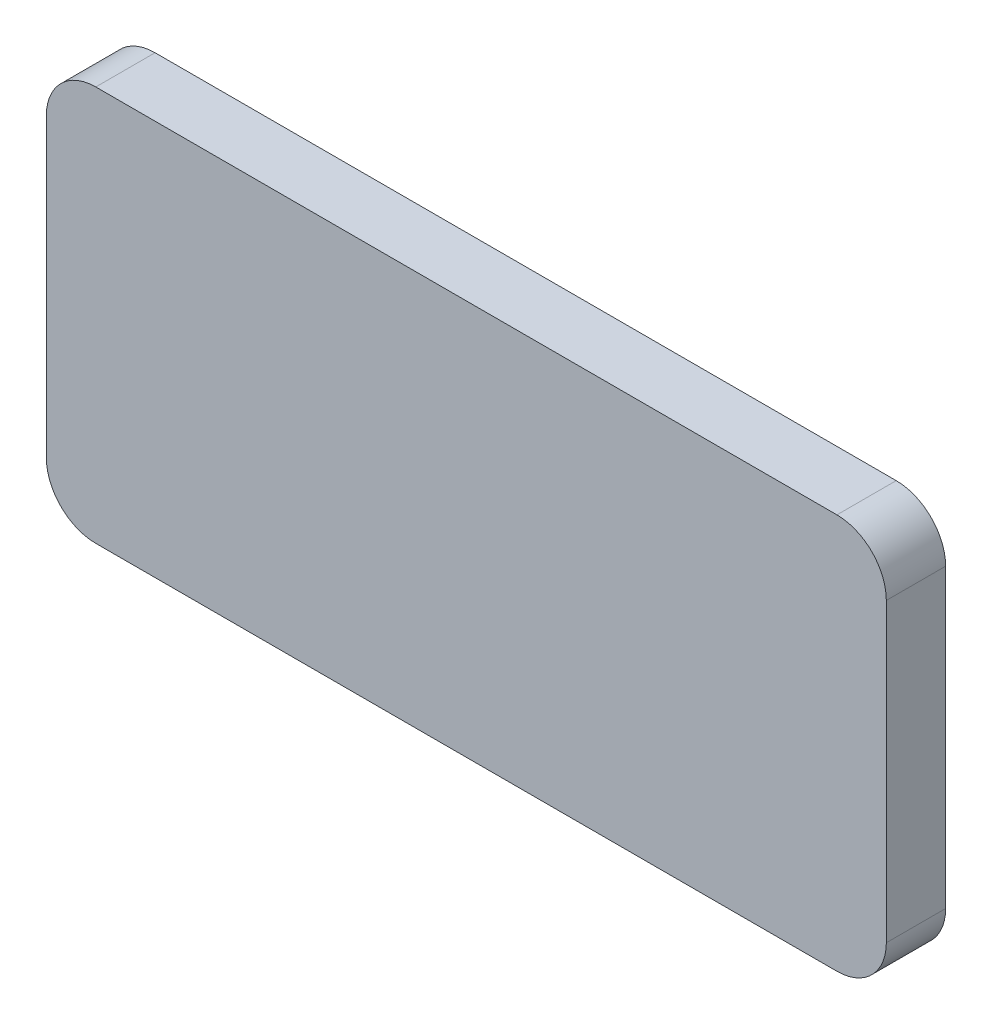
ISO-10303-21;
HEADER;
FILE_DESCRIPTION(('STEP AP214'),'2;1');
FILE_NAME('part.step','',(''),(''),'','','');
FILE_SCHEMA(('AUTOMOTIVE_DESIGN { 1 0 10303 214 1 1 1 1 }'));
ENDSEC;
DATA;
#1=APPLICATION_CONTEXT('core data for automotive mechanical design processes');
#2=APPLICATION_PROTOCOL_DEFINITION('international standard','automotive_design',2000,#1);
#3=PRODUCT_CONTEXT('',#1,'mechanical');
#4=PRODUCT('Part','Part','',(#3));
#5=PRODUCT_RELATED_PRODUCT_CATEGORY('part','',(#4));
#6=PRODUCT_DEFINITION_FORMATION('','',#4);
#7=PRODUCT_DEFINITION_CONTEXT('part definition',#1,'design');
#8=PRODUCT_DEFINITION('design','',#6,#7);
#9=PRODUCT_DEFINITION_SHAPE('','',#8);
#10=(LENGTH_UNIT() NAMED_UNIT(*) SI_UNIT(.MILLI.,.METRE.));
#11=(NAMED_UNIT(*) PLANE_ANGLE_UNIT() SI_UNIT($,.RADIAN.));
#12=(NAMED_UNIT(*) SI_UNIT($,.STERADIAN.) SOLID_ANGLE_UNIT());
#13=UNCERTAINTY_MEASURE_WITH_UNIT(LENGTH_MEASURE(1.E-05),#10,'distance_accuracy_value','');
#14=(GEOMETRIC_REPRESENTATION_CONTEXT(3) GLOBAL_UNCERTAINTY_ASSIGNED_CONTEXT((#13)) GLOBAL_UNIT_ASSIGNED_CONTEXT((#10,
#11,#12)) REPRESENTATION_CONTEXT('',''));
#15=CARTESIAN_POINT('',(0.,0.,0.));
#16=DIRECTION('',(0.,0.,1.));
#17=DIRECTION('',(1.,0.,0.));
#18=AXIS2_PLACEMENT_3D('',#15,#16,#17);
#19=CARTESIAN_POINT('',(0.,0.,0.));
#20=DIRECTION('',(0.,0.,-1.));
#21=DIRECTION('',(-1.,0.,0.));
#22=AXIS2_PLACEMENT_3D('',#19,#20,#21);
#23=PLANE('',#22);
#24=CARTESIAN_POINT('',(75.,20.,0.));
#25=DIRECTION('',(0.,0.,-1.));
#26=DIRECTION('',(-1.,0.,0.));
#27=AXIS2_PLACEMENT_3D('',#24,#25,#26);
#28=CIRCLE('',#27,4.5);
#29=CARTESIAN_POINT('',(70.5,20.,0.));
#30=VERTEX_POINT('',#29);
#31=EDGE_CURVE('E832',#30,#30,#28,.T.);
#32=ORIENTED_EDGE('',*,*,#31,.F.);
#33=EDGE_LOOP('',(#32));
#34=FACE_BOUND('',#33,.T.);
#35=CARTESIAN_POINT('',(64.,9.,0.));
#36=DIRECTION('',(0.,0.,-1.));
#37=DIRECTION('',(-1.,0.,0.));
#38=AXIS2_PLACEMENT_3D('',#35,#36,#37);
#39=CIRCLE('',#38,4.5);
#40=CARTESIAN_POINT('',(59.5,9.,0.));
#41=VERTEX_POINT('',#40);
#42=EDGE_CURVE('E826',#41,#41,#39,.T.);
#43=ORIENTED_EDGE('',*,*,#42,.F.);
#44=EDGE_LOOP('',(#43));
#45=FACE_BOUND('',#44,.T.);
#46=CARTESIAN_POINT('',(53.,9.,0.));
#47=DIRECTION('',(0.,0.,-1.));
#48=DIRECTION('',(-1.,0.,0.));
#49=AXIS2_PLACEMENT_3D('',#46,#47,#48);
#50=CIRCLE('',#49,4.5);
#51=CARTESIAN_POINT('',(48.5,9.,0.));
#52=VERTEX_POINT('',#51);
#53=EDGE_CURVE('E820',#52,#52,#50,.T.);
#54=ORIENTED_EDGE('',*,*,#53,.F.);
#55=EDGE_LOOP('',(#54));
#56=FACE_BOUND('',#55,.T.);
#57=CARTESIAN_POINT('',(42.,9.,0.));
#58=DIRECTION('',(0.,0.,-1.));
#59=DIRECTION('',(-1.,0.,0.));
#60=AXIS2_PLACEMENT_3D('',#57,#58,#59);
#61=CIRCLE('',#60,4.5);
#62=CARTESIAN_POINT('',(37.5,9.,0.));
#63=VERTEX_POINT('',#62);
#64=EDGE_CURVE('E814',#63,#63,#61,.T.);
#65=ORIENTED_EDGE('',*,*,#64,.F.);
#66=EDGE_LOOP('',(#65));
#67=FACE_BOUND('',#66,.T.);
#68=CARTESIAN_POINT('',(31.,9.,0.));
#69=DIRECTION('',(0.,0.,-1.));
#70=DIRECTION('',(-1.,0.,0.));
#71=AXIS2_PLACEMENT_3D('',#68,#69,#70);
#72=CIRCLE('',#71,4.5);
#73=CARTESIAN_POINT('',(26.5,9.,0.));
#74=VERTEX_POINT('',#73);
#75=EDGE_CURVE('E808',#74,#74,#72,.T.);
#76=ORIENTED_EDGE('',*,*,#75,.F.);
#77=EDGE_LOOP('',(#76));
#78=FACE_BOUND('',#77,.T.);
#79=CARTESIAN_POINT('',(20.,9.,0.));
#80=DIRECTION('',(0.,0.,-1.));
#81=DIRECTION('',(-1.,0.,0.));
#82=AXIS2_PLACEMENT_3D('',#79,#80,#81);
#83=CIRCLE('',#82,4.5);
#84=CARTESIAN_POINT('',(15.5,9.,0.));
#85=VERTEX_POINT('',#84);
#86=EDGE_CURVE('E802',#85,#85,#83,.T.);
#87=ORIENTED_EDGE('',*,*,#86,.F.);
#88=EDGE_LOOP('',(#87));
#89=FACE_BOUND('',#88,.T.);
#90=CARTESIAN_POINT('',(9.,9.,0.));
#91=DIRECTION('',(0.,0.,-1.));
#92=DIRECTION('',(-1.,0.,0.));
#93=AXIS2_PLACEMENT_3D('',#90,#91,#92);
#94=CIRCLE('',#93,4.5);
#95=CARTESIAN_POINT('',(4.5,9.,0.));
#96=VERTEX_POINT('',#95);
#97=EDGE_CURVE('E381',#96,#96,#94,.T.);
#98=ORIENTED_EDGE('',*,*,#97,.F.);
#99=EDGE_LOOP('',(#98));
#100=FACE_BOUND('',#99,.T.);
#101=CARTESIAN_POINT('',(64.,20.,0.));
#102=DIRECTION('',(0.,0.,-1.));
#103=DIRECTION('',(-1.,0.,0.));
#104=AXIS2_PLACEMENT_3D('',#101,#102,#103);
#105=CIRCLE('',#104,4.5);
#106=CARTESIAN_POINT('',(59.5,20.,0.));
#107=VERTEX_POINT('',#106);
#108=EDGE_CURVE('E172',#107,#107,#105,.T.);
#109=ORIENTED_EDGE('',*,*,#108,.F.);
#110=EDGE_LOOP('',(#109));
#111=FACE_BOUND('',#110,.T.);
#112=CARTESIAN_POINT('',(53.,20.,0.));
#113=DIRECTION('',(0.,0.,-1.));
#114=DIRECTION('',(-1.,0.,0.));
#115=AXIS2_PLACEMENT_3D('',#112,#113,#114);
#116=CIRCLE('',#115,4.5);
#117=CARTESIAN_POINT('',(48.5,20.,0.));
#118=VERTEX_POINT('',#117);
#119=EDGE_CURVE('E169',#118,#118,#116,.T.);
#120=ORIENTED_EDGE('',*,*,#119,.F.);
#121=EDGE_LOOP('',(#120));
#122=FACE_BOUND('',#121,.T.);
#123=CARTESIAN_POINT('',(42.,20.,0.));
#124=DIRECTION('',(0.,0.,-1.));
#125=DIRECTION('',(-1.,0.,0.));
#126=AXIS2_PLACEMENT_3D('',#123,#124,#125);
#127=CIRCLE('',#126,4.5);
#128=CARTESIAN_POINT('',(37.5,20.,0.));
#129=VERTEX_POINT('',#128);
#130=EDGE_CURVE('E166',#129,#129,#127,.T.);
#131=ORIENTED_EDGE('',*,*,#130,.F.);
#132=EDGE_LOOP('',(#131));
#133=FACE_BOUND('',#132,.T.);
#134=CARTESIAN_POINT('',(31.,20.,0.));
#135=DIRECTION('',(0.,0.,-1.));
#136=DIRECTION('',(-1.,0.,0.));
#137=AXIS2_PLACEMENT_3D('',#134,#135,#136);
#138=CIRCLE('',#137,4.5);
#139=CARTESIAN_POINT('',(26.5,20.,0.));
#140=VERTEX_POINT('',#139);
#141=EDGE_CURVE('E163',#140,#140,#138,.T.);
#142=ORIENTED_EDGE('',*,*,#141,.F.);
#143=EDGE_LOOP('',(#142));
#144=FACE_BOUND('',#143,.T.);
#145=CARTESIAN_POINT('',(20.,20.,0.));
#146=DIRECTION('',(0.,0.,-1.));
#147=DIRECTION('',(-1.,0.,0.));
#148=AXIS2_PLACEMENT_3D('',#145,#146,#147);
#149=CIRCLE('',#148,4.5);
#150=CARTESIAN_POINT('',(15.5,20.,0.));
#151=VERTEX_POINT('',#150);
#152=EDGE_CURVE('E792',#151,#151,#149,.T.);
#153=ORIENTED_EDGE('',*,*,#152,.F.);
#154=EDGE_LOOP('',(#153));
#155=FACE_BOUND('',#154,.T.);
#156=DIRECTION('',(1.,0.,0.));
#157=VECTOR('',#156,1.);
#158=CARTESIAN_POINT('',(0.,0.,0.));
#159=LINE('',#158,#157);
#160=CARTESIAN_POINT('',(5.,0.,0.));
#161=VERTEX_POINT('',#160);
#162=CARTESIAN_POINT('',(80.,0.,0.));
#163=VERTEX_POINT('',#162);
#164=EDGE_CURVE('E117',#161,#163,#159,.T.);
#165=ORIENTED_EDGE('',*,*,#164,.F.);
#166=CARTESIAN_POINT('',(5.,5.,0.));
#167=DIRECTION('',(0.,0.,-1.));
#168=DIRECTION('',(-1.,0.,0.));
#169=AXIS2_PLACEMENT_3D('',#166,#167,#168);
#170=CIRCLE('',#169,5.);
#171=CARTESIAN_POINT('',(0.,5.,0.));
#172=VERTEX_POINT('',#171);
#173=EDGE_CURVE('E100',#161,#172,#170,.T.);
#174=ORIENTED_EDGE('',*,*,#173,.T.);
#175=DIRECTION('',(0.,-1.,0.));
#176=VECTOR('',#175,1.);
#177=CARTESIAN_POINT('',(0.,0.,0.));
#178=LINE('',#177,#176);
#179=CARTESIAN_POINT('',(0.,35.,0.));
#180=VERTEX_POINT('',#179);
#181=EDGE_CURVE('E127',#180,#172,#178,.T.);
#182=ORIENTED_EDGE('',*,*,#181,.F.);
#183=CARTESIAN_POINT('',(5.,35.,0.));
#184=DIRECTION('',(0.,0.,-1.));
#185=DIRECTION('',(-1.,0.,0.));
#186=AXIS2_PLACEMENT_3D('',#183,#184,#185);
#187=CIRCLE('',#186,5.);
#188=CARTESIAN_POINT('',(5.,40.,0.));
#189=VERTEX_POINT('',#188);
#190=EDGE_CURVE('E121',#180,#189,#187,.T.);
#191=ORIENTED_EDGE('',*,*,#190,.T.);
#192=DIRECTION('',(-1.,0.,0.));
#193=VECTOR('',#192,1.);
#194=CARTESIAN_POINT('',(0.,40.,0.));
#195=LINE('',#194,#193);
#196=CARTESIAN_POINT('',(80.,40.,0.));
#197=VERTEX_POINT('',#196);
#198=EDGE_CURVE('E130',#197,#189,#195,.T.);
#199=ORIENTED_EDGE('',*,*,#198,.F.);
#200=CARTESIAN_POINT('',(80.,35.,0.));
#201=DIRECTION('',(0.,0.,-1.));
#202=DIRECTION('',(-1.,0.,0.));
#203=AXIS2_PLACEMENT_3D('',#200,#201,#202);
#204=CIRCLE('',#203,5.);
#205=CARTESIAN_POINT('',(85.,35.,0.));
#206=VERTEX_POINT('',#205);
#207=EDGE_CURVE('E141',#197,#206,#204,.T.);
#208=ORIENTED_EDGE('',*,*,#207,.T.);
#209=DIRECTION('',(0.,1.,0.));
#210=VECTOR('',#209,1.);
#211=CARTESIAN_POINT('',(85.,0.,0.));
#212=LINE('',#211,#210);
#213=CARTESIAN_POINT('',(85.,5.,0.));
#214=VERTEX_POINT('',#213);
#215=EDGE_CURVE('E126',#214,#206,#212,.T.);
#216=ORIENTED_EDGE('',*,*,#215,.F.);
#217=CARTESIAN_POINT('',(80.,5.,0.));
#218=DIRECTION('',(0.,0.,-1.));
#219=DIRECTION('',(-1.,0.,0.));
#220=AXIS2_PLACEMENT_3D('',#217,#218,#219);
#221=CIRCLE('',#220,5.);
#222=EDGE_CURVE('E111',#214,#163,#221,.T.);
#223=ORIENTED_EDGE('',*,*,#222,.T.);
#224=EDGE_LOOP('',(#165,#174,#182,#191,#199,#208,#216,#223));
#225=FACE_BOUND('',#224,.T.);
#226=CARTESIAN_POINT('',(9.,31.,0.));
#227=DIRECTION('',(0.,0.,-1.));
#228=DIRECTION('',(-1.,0.,0.));
#229=AXIS2_PLACEMENT_3D('',#226,#227,#228);
#230=CIRCLE('',#229,4.5);
#231=CARTESIAN_POINT('',(4.5,31.,0.));
#232=VERTEX_POINT('',#231);
#233=EDGE_CURVE('E132',#232,#232,#230,.T.);
#234=ORIENTED_EDGE('',*,*,#233,.F.);
#235=EDGE_LOOP('',(#234));
#236=FACE_BOUND('',#235,.T.);
#237=CARTESIAN_POINT('',(9.,20.,0.));
#238=DIRECTION('',(0.,0.,-1.));
#239=DIRECTION('',(-1.,0.,0.));
#240=AXIS2_PLACEMENT_3D('',#237,#238,#239);
#241=CIRCLE('',#240,4.5);
#242=CARTESIAN_POINT('',(4.5,20.,0.));
#243=VERTEX_POINT('',#242);
#244=EDGE_CURVE('E795',#243,#243,#241,.T.);
#245=ORIENTED_EDGE('',*,*,#244,.F.);
#246=EDGE_LOOP('',(#245));
#247=FACE_BOUND('',#246,.T.);
#248=CARTESIAN_POINT('',(20.,31.,0.));
#249=DIRECTION('',(0.,0.,-1.));
#250=DIRECTION('',(-1.,0.,0.));
#251=AXIS2_PLACEMENT_3D('',#248,#249,#250);
#252=CIRCLE('',#251,4.5);
#253=CARTESIAN_POINT('',(15.5,31.,0.));
#254=VERTEX_POINT('',#253);
#255=EDGE_CURVE('E799',#254,#254,#252,.T.);
#256=ORIENTED_EDGE('',*,*,#255,.F.);
#257=EDGE_LOOP('',(#256));
#258=FACE_BOUND('',#257,.T.);
#259=CARTESIAN_POINT('',(31.,31.,0.));
#260=DIRECTION('',(0.,0.,-1.));
#261=DIRECTION('',(-1.,0.,0.));
#262=AXIS2_PLACEMENT_3D('',#259,#260,#261);
#263=CIRCLE('',#262,4.5);
#264=CARTESIAN_POINT('',(26.5,31.,0.));
#265=VERTEX_POINT('',#264);
#266=EDGE_CURVE('E805',#265,#265,#263,.T.);
#267=ORIENTED_EDGE('',*,*,#266,.F.);
#268=EDGE_LOOP('',(#267));
#269=FACE_BOUND('',#268,.T.);
#270=CARTESIAN_POINT('',(42.,31.,0.));
#271=DIRECTION('',(0.,0.,-1.));
#272=DIRECTION('',(-1.,0.,0.));
#273=AXIS2_PLACEMENT_3D('',#270,#271,#272);
#274=CIRCLE('',#273,4.5);
#275=CARTESIAN_POINT('',(37.5,31.,0.));
#276=VERTEX_POINT('',#275);
#277=EDGE_CURVE('E811',#276,#276,#274,.T.);
#278=ORIENTED_EDGE('',*,*,#277,.F.);
#279=EDGE_LOOP('',(#278));
#280=FACE_BOUND('',#279,.T.);
#281=CARTESIAN_POINT('',(53.,31.,0.));
#282=DIRECTION('',(0.,0.,-1.));
#283=DIRECTION('',(-1.,0.,0.));
#284=AXIS2_PLACEMENT_3D('',#281,#282,#283);
#285=CIRCLE('',#284,4.5);
#286=CARTESIAN_POINT('',(48.5,31.,0.));
#287=VERTEX_POINT('',#286);
#288=EDGE_CURVE('E817',#287,#287,#285,.T.);
#289=ORIENTED_EDGE('',*,*,#288,.F.);
#290=EDGE_LOOP('',(#289));
#291=FACE_BOUND('',#290,.T.);
#292=CARTESIAN_POINT('',(64.,31.,0.));
#293=DIRECTION('',(0.,0.,-1.));
#294=DIRECTION('',(-1.,0.,0.));
#295=AXIS2_PLACEMENT_3D('',#292,#293,#294);
#296=CIRCLE('',#295,4.5);
#297=CARTESIAN_POINT('',(59.5,31.,0.));
#298=VERTEX_POINT('',#297);
#299=EDGE_CURVE('E823',#298,#298,#296,.T.);
#300=ORIENTED_EDGE('',*,*,#299,.F.);
#301=EDGE_LOOP('',(#300));
#302=FACE_BOUND('',#301,.T.);
#303=CARTESIAN_POINT('',(75.,31.,0.));
#304=DIRECTION('',(0.,0.,-1.));
#305=DIRECTION('',(-1.,0.,0.));
#306=AXIS2_PLACEMENT_3D('',#303,#304,#305);
#307=CIRCLE('',#306,4.5);
#308=CARTESIAN_POINT('',(70.5,31.,0.));
#309=VERTEX_POINT('',#308);
#310=EDGE_CURVE('E829',#309,#309,#307,.T.);
#311=ORIENTED_EDGE('',*,*,#310,.F.);
#312=EDGE_LOOP('',(#311));
#313=FACE_BOUND('',#312,.T.);
#314=CARTESIAN_POINT('',(75.,9.,0.));
#315=DIRECTION('',(0.,0.,-1.));
#316=DIRECTION('',(-1.,0.,0.));
#317=AXIS2_PLACEMENT_3D('',#314,#315,#316);
#318=CIRCLE('',#317,4.5);
#319=CARTESIAN_POINT('',(70.5,9.,0.));
#320=VERTEX_POINT('',#319);
#321=EDGE_CURVE('E835',#320,#320,#318,.T.);
#322=ORIENTED_EDGE('',*,*,#321,.F.);
#323=EDGE_LOOP('',(#322));
#324=FACE_BOUND('',#323,.T.);
#325=ADVANCED_FACE('F33',(#34,#45,#56,#67,#78,#89,#100,#111,#122,#133,#144,#155,#225,#236,#247,
#258,#269,#280,#291,#302,#313,#324),#23,.T.);
#326=CARTESIAN_POINT('',(0.,0.,6.));
#327=DIRECTION('',(1.,0.,0.));
#328=DIRECTION('',(0.,0.,-1.));
#329=AXIS2_PLACEMENT_3D('',#326,#327,#328);
#330=PLANE('',#329);
#331=ORIENTED_EDGE('',*,*,#181,.T.);
#332=DIRECTION('',(0.,0.,-1.));
#333=VECTOR('',#332,1.);
#334=CARTESIAN_POINT('',(0.,5.,6.));
#335=LINE('',#334,#333);
#336=CARTESIAN_POINT('',(0.,5.,6.));
#337=VERTEX_POINT('',#336);
#338=EDGE_CURVE('E105',#172,#337,#335,.F.);
#339=ORIENTED_EDGE('',*,*,#338,.T.);
#340=DIRECTION('',(0.,-1.,0.));
#341=VECTOR('',#340,1.);
#342=CARTESIAN_POINT('',(0.,0.,6.));
#343=LINE('',#342,#341);
#344=CARTESIAN_POINT('',(0.,35.,6.));
#345=VERTEX_POINT('',#344);
#346=EDGE_CURVE('E137',#345,#337,#343,.T.);
#347=ORIENTED_EDGE('',*,*,#346,.F.);
#348=DIRECTION('',(0.,0.,-1.));
#349=VECTOR('',#348,1.);
#350=CARTESIAN_POINT('',(0.,35.,6.));
#351=LINE('',#350,#349);
#352=EDGE_CURVE('E110',#345,#180,#351,.T.);
#353=ORIENTED_EDGE('',*,*,#352,.T.);
#354=EDGE_LOOP('',(#331,#339,#347,#353));
#355=FACE_BOUND('',#354,.T.);
#356=ADVANCED_FACE('F250',(#355),#330,.F.);
#357=CARTESIAN_POINT('',(0.,0.,6.));
#358=DIRECTION('',(0.,1.,0.));
#359=DIRECTION('',(0.,0.,1.));
#360=AXIS2_PLACEMENT_3D('',#357,#358,#359);
#361=PLANE('',#360);
#362=DIRECTION('',(1.,0.,0.));
#363=VECTOR('',#362,1.);
#364=CARTESIAN_POINT('',(0.,0.,6.));
#365=LINE('',#364,#363);
#366=CARTESIAN_POINT('',(5.,0.,6.));
#367=VERTEX_POINT('',#366);
#368=CARTESIAN_POINT('',(80.,0.,6.));
#369=VERTEX_POINT('',#368);
#370=EDGE_CURVE('E120',#367,#369,#365,.T.);
#371=ORIENTED_EDGE('',*,*,#370,.F.);
#372=DIRECTION('',(0.,0.,-1.));
#373=VECTOR('',#372,1.);
#374=CARTESIAN_POINT('',(5.,0.,6.));
#375=LINE('',#374,#373);
#376=EDGE_CURVE('E104',#367,#161,#375,.T.);
#377=ORIENTED_EDGE('',*,*,#376,.T.);
#378=ORIENTED_EDGE('',*,*,#164,.T.);
#379=DIRECTION('',(0.,0.,-1.));
#380=VECTOR('',#379,1.);
#381=CARTESIAN_POINT('',(80.,0.,6.));
#382=LINE('',#381,#380);
#383=EDGE_CURVE('E122',#163,#369,#382,.F.);
#384=ORIENTED_EDGE('',*,*,#383,.T.);
#385=EDGE_LOOP('',(#371,#377,#378,#384));
#386=FACE_BOUND('',#385,.T.);
#387=ADVANCED_FACE('F116',(#386),#361,.F.);
#388=CARTESIAN_POINT('',(85.,0.,6.));
#389=DIRECTION('',(-1.,0.,0.));
#390=DIRECTION('',(0.,0.,1.));
#391=AXIS2_PLACEMENT_3D('',#388,#389,#390);
#392=PLANE('',#391);
#393=DIRECTION('',(0.,1.,0.));
#394=VECTOR('',#393,1.);
#395=CARTESIAN_POINT('',(85.,0.,6.));
#396=LINE('',#395,#394);
#397=CARTESIAN_POINT('',(85.,5.,6.));
#398=VERTEX_POINT('',#397);
#399=CARTESIAN_POINT('',(85.,35.,6.));
#400=VERTEX_POINT('',#399);
#401=EDGE_CURVE('E781',#398,#400,#396,.T.);
#402=ORIENTED_EDGE('',*,*,#401,.F.);
#403=DIRECTION('',(0.,0.,-1.));
#404=VECTOR('',#403,1.);
#405=CARTESIAN_POINT('',(85.,5.,6.));
#406=LINE('',#405,#404);
#407=EDGE_CURVE('E156',#398,#214,#406,.T.);
#408=ORIENTED_EDGE('',*,*,#407,.T.);
#409=ORIENTED_EDGE('',*,*,#215,.T.);
#410=DIRECTION('',(0.,0.,-1.));
#411=VECTOR('',#410,1.);
#412=CARTESIAN_POINT('',(85.,35.,6.));
#413=LINE('',#412,#411);
#414=EDGE_CURVE('E154',#206,#400,#413,.F.);
#415=ORIENTED_EDGE('',*,*,#414,.T.);
#416=EDGE_LOOP('',(#402,#408,#409,#415));
#417=FACE_BOUND('',#416,.T.);
#418=ADVANCED_FACE('F267',(#417),#392,.F.);
#419=CARTESIAN_POINT('',(0.,40.,6.));
#420=DIRECTION('',(0.,-1.,0.));
#421=DIRECTION('',(0.,0.,-1.));
#422=AXIS2_PLACEMENT_3D('',#419,#420,#421);
#423=PLANE('',#422);
#424=DIRECTION('',(-1.,0.,0.));
#425=VECTOR('',#424,1.);
#426=CARTESIAN_POINT('',(0.,40.,6.));
#427=LINE('',#426,#425);
#428=CARTESIAN_POINT('',(80.,40.,6.));
#429=VERTEX_POINT('',#428);
#430=CARTESIAN_POINT('',(5.,40.,6.));
#431=VERTEX_POINT('',#430);
#432=EDGE_CURVE('E138',#429,#431,#427,.T.);
#433=ORIENTED_EDGE('',*,*,#432,.F.);
#434=DIRECTION('',(0.,0.,-1.));
#435=VECTOR('',#434,1.);
#436=CARTESIAN_POINT('',(80.,40.,6.));
#437=LINE('',#436,#435);
#438=EDGE_CURVE('E160',#429,#197,#437,.T.);
#439=ORIENTED_EDGE('',*,*,#438,.T.);
#440=ORIENTED_EDGE('',*,*,#198,.T.);
#441=DIRECTION('',(0.,0.,-1.));
#442=VECTOR('',#441,1.);
#443=CARTESIAN_POINT('',(5.,40.,6.));
#444=LINE('',#443,#442);
#445=EDGE_CURVE('E48',#189,#431,#444,.F.);
#446=ORIENTED_EDGE('',*,*,#445,.T.);
#447=EDGE_LOOP('',(#433,#439,#440,#446));
#448=FACE_BOUND('',#447,.T.);
#449=ADVANCED_FACE('F264',(#448),#423,.F.);
#450=CARTESIAN_POINT('',(0.,0.,6.));
#451=DIRECTION('',(0.,0.,-1.));
#452=DIRECTION('',(-1.,0.,0.));
#453=AXIS2_PLACEMENT_3D('',#450,#451,#452);
#454=PLANE('',#453);
#455=ORIENTED_EDGE('',*,*,#346,.T.);
#456=CARTESIAN_POINT('',(5.,5.,6.));
#457=DIRECTION('',(0.,0.,-1.));
#458=DIRECTION('',(-1.,0.,0.));
#459=AXIS2_PLACEMENT_3D('',#456,#457,#458);
#460=CIRCLE('',#459,5.);
#461=EDGE_CURVE('E152',#337,#367,#460,.F.);
#462=ORIENTED_EDGE('',*,*,#461,.T.);
#463=ORIENTED_EDGE('',*,*,#370,.T.);
#464=CARTESIAN_POINT('',(80.,5.,6.));
#465=DIRECTION('',(0.,0.,-1.));
#466=DIRECTION('',(-1.,0.,0.));
#467=AXIS2_PLACEMENT_3D('',#464,#465,#466);
#468=CIRCLE('',#467,5.);
#469=EDGE_CURVE('E150',#369,#398,#468,.F.);
#470=ORIENTED_EDGE('',*,*,#469,.T.);
#471=ORIENTED_EDGE('',*,*,#401,.T.);
#472=CARTESIAN_POINT('',(80.,35.,6.));
#473=DIRECTION('',(0.,0.,-1.));
#474=DIRECTION('',(-1.,0.,0.));
#475=AXIS2_PLACEMENT_3D('',#472,#473,#474);
#476=CIRCLE('',#475,5.);
#477=EDGE_CURVE('E55',#400,#429,#476,.F.);
#478=ORIENTED_EDGE('',*,*,#477,.T.);
#479=ORIENTED_EDGE('',*,*,#432,.T.);
#480=CARTESIAN_POINT('',(5.,35.,6.));
#481=DIRECTION('',(0.,0.,-1.));
#482=DIRECTION('',(-1.,0.,0.));
#483=AXIS2_PLACEMENT_3D('',#480,#481,#482);
#484=CIRCLE('',#483,5.);
#485=EDGE_CURVE('E147',#431,#345,#484,.F.);
#486=ORIENTED_EDGE('',*,*,#485,.T.);
#487=EDGE_LOOP('',(#455,#462,#463,#470,#471,#478,#479,#486));
#488=FACE_BOUND('',#487,.T.);
#489=ADVANCED_FACE('F262',(#488),#454,.F.);
#490=CARTESIAN_POINT('',(5.,5.,6.));
#491=DIRECTION('',(0.,0.,-1.));
#492=DIRECTION('',(-1.,0.,0.));
#493=AXIS2_PLACEMENT_3D('',#490,#491,#492);
#494=CYLINDRICAL_SURFACE('',#493,5.);
#495=ORIENTED_EDGE('',*,*,#461,.F.);
#496=ORIENTED_EDGE('',*,*,#338,.F.);
#497=ORIENTED_EDGE('',*,*,#173,.F.);
#498=ORIENTED_EDGE('',*,*,#376,.F.);
#499=EDGE_LOOP('',(#495,#496,#497,#498));
#500=FACE_BOUND('',#499,.T.);
#501=ADVANCED_FACE('F103',(#500),#494,.T.);
#502=CARTESIAN_POINT('',(80.,5.,6.));
#503=DIRECTION('',(0.,0.,-1.));
#504=DIRECTION('',(-1.,0.,0.));
#505=AXIS2_PLACEMENT_3D('',#502,#503,#504);
#506=CYLINDRICAL_SURFACE('',#505,5.);
#507=ORIENTED_EDGE('',*,*,#469,.F.);
#508=ORIENTED_EDGE('',*,*,#383,.F.);
#509=ORIENTED_EDGE('',*,*,#222,.F.);
#510=ORIENTED_EDGE('',*,*,#407,.F.);
#511=EDGE_LOOP('',(#507,#508,#509,#510));
#512=FACE_BOUND('',#511,.T.);
#513=ADVANCED_FACE('F275',(#512),#506,.T.);
#514=CARTESIAN_POINT('',(80.,35.,6.));
#515=DIRECTION('',(0.,0.,-1.));
#516=DIRECTION('',(-1.,0.,0.));
#517=AXIS2_PLACEMENT_3D('',#514,#515,#516);
#518=CYLINDRICAL_SURFACE('',#517,5.);
#519=ORIENTED_EDGE('',*,*,#477,.F.);
#520=ORIENTED_EDGE('',*,*,#414,.F.);
#521=ORIENTED_EDGE('',*,*,#207,.F.);
#522=ORIENTED_EDGE('',*,*,#438,.F.);
#523=EDGE_LOOP('',(#519,#520,#521,#522));
#524=FACE_BOUND('',#523,.T.);
#525=ADVANCED_FACE('F278',(#524),#518,.T.);
#526=CARTESIAN_POINT('',(5.,35.,6.));
#527=DIRECTION('',(0.,0.,-1.));
#528=DIRECTION('',(-1.,0.,0.));
#529=AXIS2_PLACEMENT_3D('',#526,#527,#528);
#530=CYLINDRICAL_SURFACE('',#529,5.);
#531=ORIENTED_EDGE('',*,*,#485,.F.);
#532=ORIENTED_EDGE('',*,*,#445,.F.);
#533=ORIENTED_EDGE('',*,*,#190,.F.);
#534=ORIENTED_EDGE('',*,*,#352,.F.);
#535=EDGE_LOOP('',(#531,#532,#533,#534));
#536=FACE_BOUND('',#535,.T.);
#537=ADVANCED_FACE('F282',(#536),#530,.T.);
#538=CARTESIAN_POINT('',(9.,31.,-1.));
#539=DIRECTION('',(0.,0.,-1.));
#540=DIRECTION('',(-1.,0.,0.));
#541=AXIS2_PLACEMENT_3D('',#538,#539,#540);
#542=PLANE('',#541);
#543=CARTESIAN_POINT('',(9.,31.,-1.));
#544=DIRECTION('',(0.,0.,-1.));
#545=DIRECTION('',(-1.,0.,0.));
#546=AXIS2_PLACEMENT_3D('',#543,#544,#545);
#547=CIRCLE('',#546,1.5);
#548=CARTESIAN_POINT('',(7.5,31.,-1.));
#549=VERTEX_POINT('',#548);
#550=EDGE_CURVE('E41',#549,#549,#547,.T.);
#551=ORIENTED_EDGE('',*,*,#550,.T.);
#552=EDGE_LOOP('',(#551));
#553=FACE_BOUND('',#552,.T.);
#554=ADVANCED_FACE('F234',(#553),#542,.T.);
#555=CARTESIAN_POINT('',(20.,20.,-1.));
#556=DIRECTION('',(0.,0.,-1.));
#557=DIRECTION('',(-1.,0.,0.));
#558=AXIS2_PLACEMENT_3D('',#555,#556,#557);
#559=PLANE('',#558);
#560=CARTESIAN_POINT('',(20.,20.,-1.));
#561=DIRECTION('',(0.,0.,-1.));
#562=DIRECTION('',(-1.,0.,0.));
#563=AXIS2_PLACEMENT_3D('',#560,#561,#562);
#564=CIRCLE('',#563,1.5);
#565=CARTESIAN_POINT('',(18.5,20.,-1.));
#566=VERTEX_POINT('',#565);
#567=EDGE_CURVE('E220',#566,#566,#564,.T.);
#568=ORIENTED_EDGE('',*,*,#567,.T.);
#569=EDGE_LOOP('',(#568));
#570=FACE_BOUND('',#569,.T.);
#571=ADVANCED_FACE('F291',(#570),#559,.T.);
#572=CARTESIAN_POINT('',(31.,20.,-1.));
#573=DIRECTION('',(0.,0.,-1.));
#574=DIRECTION('',(-1.,0.,0.));
#575=AXIS2_PLACEMENT_3D('',#572,#573,#574);
#576=PLANE('',#575);
#577=CARTESIAN_POINT('',(31.,20.,-1.));
#578=DIRECTION('',(0.,0.,-1.));
#579=DIRECTION('',(-1.,0.,0.));
#580=AXIS2_PLACEMENT_3D('',#577,#578,#579);
#581=CIRCLE('',#580,1.5);
#582=CARTESIAN_POINT('',(29.5,20.,-1.));
#583=VERTEX_POINT('',#582);
#584=EDGE_CURVE('E214',#583,#583,#581,.T.);
#585=ORIENTED_EDGE('',*,*,#584,.T.);
#586=EDGE_LOOP('',(#585));
#587=FACE_BOUND('',#586,.T.);
#588=ADVANCED_FACE('F287',(#587),#576,.T.);
#589=CARTESIAN_POINT('',(42.,20.,-1.));
#590=DIRECTION('',(0.,0.,-1.));
#591=DIRECTION('',(-1.,0.,0.));
#592=AXIS2_PLACEMENT_3D('',#589,#590,#591);
#593=PLANE('',#592);
#594=CARTESIAN_POINT('',(42.,20.,-1.));
#595=DIRECTION('',(0.,0.,-1.));
#596=DIRECTION('',(-1.,0.,0.));
#597=AXIS2_PLACEMENT_3D('',#594,#595,#596);
#598=CIRCLE('',#597,1.5);
#599=CARTESIAN_POINT('',(40.5,20.,-1.));
#600=VERTEX_POINT('',#599);
#601=EDGE_CURVE('E205',#600,#600,#598,.T.);
#602=ORIENTED_EDGE('',*,*,#601,.T.);
#603=EDGE_LOOP('',(#602));
#604=FACE_BOUND('',#603,.T.);
#605=ADVANCED_FACE('F290',(#604),#593,.T.);
#606=CARTESIAN_POINT('',(53.,20.,-1.));
#607=DIRECTION('',(0.,0.,-1.));
#608=DIRECTION('',(-1.,0.,0.));
#609=AXIS2_PLACEMENT_3D('',#606,#607,#608);
#610=PLANE('',#609);
#611=CARTESIAN_POINT('',(53.,20.,-1.));
#612=DIRECTION('',(0.,0.,-1.));
#613=DIRECTION('',(-1.,0.,0.));
#614=AXIS2_PLACEMENT_3D('',#611,#612,#613);
#615=CIRCLE('',#614,1.5);
#616=CARTESIAN_POINT('',(51.5,20.,-1.));
#617=VERTEX_POINT('',#616);
#618=EDGE_CURVE('E196',#617,#617,#615,.T.);
#619=ORIENTED_EDGE('',*,*,#618,.T.);
#620=EDGE_LOOP('',(#619));
#621=FACE_BOUND('',#620,.T.);
#622=ADVANCED_FACE('F295',(#621),#610,.T.);
#623=CARTESIAN_POINT('',(64.,20.,-1.));
#624=DIRECTION('',(0.,0.,-1.));
#625=DIRECTION('',(-1.,0.,0.));
#626=AXIS2_PLACEMENT_3D('',#623,#624,#625);
#627=PLANE('',#626);
#628=CARTESIAN_POINT('',(64.,20.,-1.));
#629=DIRECTION('',(0.,0.,-1.));
#630=DIRECTION('',(-1.,0.,0.));
#631=AXIS2_PLACEMENT_3D('',#628,#629,#630);
#632=CIRCLE('',#631,1.5);
#633=CARTESIAN_POINT('',(62.5,20.,-1.));
#634=VERTEX_POINT('',#633);
#635=EDGE_CURVE('E187',#634,#634,#632,.T.);
#636=ORIENTED_EDGE('',*,*,#635,.T.);
#637=EDGE_LOOP('',(#636));
#638=FACE_BOUND('',#637,.T.);
#639=ADVANCED_FACE('F299',(#638),#627,.T.);
#640=CARTESIAN_POINT('',(9.,20.,-1.));
#641=DIRECTION('',(0.,0.,-1.));
#642=DIRECTION('',(-1.,0.,0.));
#643=AXIS2_PLACEMENT_3D('',#640,#641,#642);
#644=PLANE('',#643);
#645=CARTESIAN_POINT('',(9.,20.,-1.));
#646=DIRECTION('',(0.,0.,-1.));
#647=DIRECTION('',(-1.,0.,0.));
#648=AXIS2_PLACEMENT_3D('',#645,#646,#647);
#649=CIRCLE('',#648,1.5);
#650=CARTESIAN_POINT('',(7.5,20.,-1.));
#651=VERTEX_POINT('',#650);
#652=EDGE_CURVE('E229',#651,#651,#649,.T.);
#653=ORIENTED_EDGE('',*,*,#652,.T.);
#654=EDGE_LOOP('',(#653));
#655=FACE_BOUND('',#654,.T.);
#656=ADVANCED_FACE('F303',(#655),#644,.T.);
#657=CARTESIAN_POINT('',(9.,9.,-1.));
#658=DIRECTION('',(0.,0.,-1.));
#659=DIRECTION('',(-1.,0.,0.));
#660=AXIS2_PLACEMENT_3D('',#657,#658,#659);
#661=PLANE('',#660);
#662=CARTESIAN_POINT('',(9.,9.,-1.));
#663=DIRECTION('',(0.,0.,-1.));
#664=DIRECTION('',(-1.,0.,0.));
#665=AXIS2_PLACEMENT_3D('',#662,#663,#664);
#666=CIRCLE('',#665,1.5);
#667=CARTESIAN_POINT('',(7.5,9.,-1.));
#668=VERTEX_POINT('',#667);
#669=EDGE_CURVE('E226',#668,#668,#666,.T.);
#670=ORIENTED_EDGE('',*,*,#669,.T.);
#671=EDGE_LOOP('',(#670));
#672=FACE_BOUND('',#671,.T.);
#673=ADVANCED_FACE('F384',(#672),#661,.T.);
#674=CARTESIAN_POINT('',(20.,31.,-1.));
#675=DIRECTION('',(0.,0.,-1.));
#676=DIRECTION('',(-1.,0.,0.));
#677=AXIS2_PLACEMENT_3D('',#674,#675,#676);
#678=PLANE('',#677);
#679=CARTESIAN_POINT('',(20.,31.,-1.));
#680=DIRECTION('',(0.,0.,-1.));
#681=DIRECTION('',(-1.,0.,0.));
#682=AXIS2_PLACEMENT_3D('',#679,#680,#681);
#683=CIRCLE('',#682,1.5);
#684=CARTESIAN_POINT('',(18.5,31.,-1.));
#685=VERTEX_POINT('',#684);
#686=EDGE_CURVE('E11',#685,#685,#683,.T.);
#687=ORIENTED_EDGE('',*,*,#686,.T.);
#688=EDGE_LOOP('',(#687));
#689=FACE_BOUND('',#688,.T.);
#690=ADVANCED_FACE('F386',(#689),#678,.T.);
#691=CARTESIAN_POINT('',(20.,9.,-1.));
#692=DIRECTION('',(0.,0.,-1.));
#693=DIRECTION('',(-1.,0.,0.));
#694=AXIS2_PLACEMENT_3D('',#691,#692,#693);
#695=PLANE('',#694);
#696=CARTESIAN_POINT('',(20.,9.,-1.));
#697=DIRECTION('',(0.,0.,-1.));
#698=DIRECTION('',(-1.,0.,0.));
#699=AXIS2_PLACEMENT_3D('',#696,#697,#698);
#700=CIRCLE('',#699,1.5);
#701=CARTESIAN_POINT('',(18.5,9.,-1.));
#702=VERTEX_POINT('',#701);
#703=EDGE_CURVE('E223',#702,#702,#700,.T.);
#704=ORIENTED_EDGE('',*,*,#703,.T.);
#705=EDGE_LOOP('',(#704));
#706=FACE_BOUND('',#705,.T.);
#707=ADVANCED_FACE('F392',(#706),#695,.T.);
#708=CARTESIAN_POINT('',(31.,31.,-1.));
#709=DIRECTION('',(0.,0.,-1.));
#710=DIRECTION('',(-1.,0.,0.));
#711=AXIS2_PLACEMENT_3D('',#708,#709,#710);
#712=PLANE('',#711);
#713=CARTESIAN_POINT('',(31.,31.,-1.));
#714=DIRECTION('',(0.,0.,-1.));
#715=DIRECTION('',(-1.,0.,0.));
#716=AXIS2_PLACEMENT_3D('',#713,#714,#715);
#717=CIRCLE('',#716,1.5);
#718=CARTESIAN_POINT('',(29.5,31.,-1.));
#719=VERTEX_POINT('',#718);
#720=EDGE_CURVE('E211',#719,#719,#717,.T.);
#721=ORIENTED_EDGE('',*,*,#720,.T.);
#722=EDGE_LOOP('',(#721));
#723=FACE_BOUND('',#722,.T.);
#724=ADVANCED_FACE('F449',(#723),#712,.T.);
#725=CARTESIAN_POINT('',(31.,9.,-1.));
#726=DIRECTION('',(0.,0.,-1.));
#727=DIRECTION('',(-1.,0.,0.));
#728=AXIS2_PLACEMENT_3D('',#725,#726,#727);
#729=PLANE('',#728);
#730=CARTESIAN_POINT('',(31.,9.,-1.));
#731=DIRECTION('',(0.,0.,-1.));
#732=DIRECTION('',(-1.,0.,0.));
#733=AXIS2_PLACEMENT_3D('',#730,#731,#732);
#734=CIRCLE('',#733,1.5);
#735=CARTESIAN_POINT('',(29.5,9.,-1.));
#736=VERTEX_POINT('',#735);
#737=EDGE_CURVE('E217',#736,#736,#734,.T.);
#738=ORIENTED_EDGE('',*,*,#737,.T.);
#739=EDGE_LOOP('',(#738));
#740=FACE_BOUND('',#739,.T.);
#741=ADVANCED_FACE('F458',(#740),#729,.T.);
#742=CARTESIAN_POINT('',(42.,31.,-1.));
#743=DIRECTION('',(0.,0.,-1.));
#744=DIRECTION('',(-1.,0.,0.));
#745=AXIS2_PLACEMENT_3D('',#742,#743,#744);
#746=PLANE('',#745);
#747=CARTESIAN_POINT('',(42.,31.,-1.));
#748=DIRECTION('',(0.,0.,-1.));
#749=DIRECTION('',(-1.,0.,0.));
#750=AXIS2_PLACEMENT_3D('',#747,#748,#749);
#751=CIRCLE('',#750,1.5);
#752=CARTESIAN_POINT('',(40.5,31.,-1.));
#753=VERTEX_POINT('',#752);
#754=EDGE_CURVE('E208',#753,#753,#751,.T.);
#755=ORIENTED_EDGE('',*,*,#754,.T.);
#756=EDGE_LOOP('',(#755));
#757=FACE_BOUND('',#756,.T.);
#758=ADVANCED_FACE('F468',(#757),#746,.T.);
#759=CARTESIAN_POINT('',(42.,9.,-1.));
#760=DIRECTION('',(0.,0.,-1.));
#761=DIRECTION('',(-1.,0.,0.));
#762=AXIS2_PLACEMENT_3D('',#759,#760,#761);
#763=PLANE('',#762);
#764=CARTESIAN_POINT('',(42.,9.,-1.));
#765=DIRECTION('',(0.,0.,-1.));
#766=DIRECTION('',(-1.,0.,0.));
#767=AXIS2_PLACEMENT_3D('',#764,#765,#766);
#768=CIRCLE('',#767,1.5);
#769=CARTESIAN_POINT('',(40.5,9.,-1.));
#770=VERTEX_POINT('',#769);
#771=EDGE_CURVE('E202',#770,#770,#768,.T.);
#772=ORIENTED_EDGE('',*,*,#771,.T.);
#773=EDGE_LOOP('',(#772));
#774=FACE_BOUND('',#773,.T.);
#775=ADVANCED_FACE('F478',(#774),#763,.T.);
#776=CARTESIAN_POINT('',(53.,31.,-1.));
#777=DIRECTION('',(0.,0.,-1.));
#778=DIRECTION('',(-1.,0.,0.));
#779=AXIS2_PLACEMENT_3D('',#776,#777,#778);
#780=PLANE('',#779);
#781=CARTESIAN_POINT('',(53.,31.,-1.));
#782=DIRECTION('',(0.,0.,-1.));
#783=DIRECTION('',(-1.,0.,0.));
#784=AXIS2_PLACEMENT_3D('',#781,#782,#783);
#785=CIRCLE('',#784,1.5);
#786=CARTESIAN_POINT('',(51.5,31.,-1.));
#787=VERTEX_POINT('',#786);
#788=EDGE_CURVE('E193',#787,#787,#785,.T.);
#789=ORIENTED_EDGE('',*,*,#788,.T.);
#790=EDGE_LOOP('',(#789));
#791=FACE_BOUND('',#790,.T.);
#792=ADVANCED_FACE('F488',(#791),#780,.T.);
#793=CARTESIAN_POINT('',(53.,9.,-1.));
#794=DIRECTION('',(0.,0.,-1.));
#795=DIRECTION('',(-1.,0.,0.));
#796=AXIS2_PLACEMENT_3D('',#793,#794,#795);
#797=PLANE('',#796);
#798=CARTESIAN_POINT('',(53.,9.,-1.));
#799=DIRECTION('',(0.,0.,-1.));
#800=DIRECTION('',(-1.,0.,0.));
#801=AXIS2_PLACEMENT_3D('',#798,#799,#800);
#802=CIRCLE('',#801,1.5);
#803=CARTESIAN_POINT('',(51.5,9.,-1.));
#804=VERTEX_POINT('',#803);
#805=EDGE_CURVE('E199',#804,#804,#802,.T.);
#806=ORIENTED_EDGE('',*,*,#805,.T.);
#807=EDGE_LOOP('',(#806));
#808=FACE_BOUND('',#807,.T.);
#809=ADVANCED_FACE('F498',(#808),#797,.T.);
#810=CARTESIAN_POINT('',(64.,31.,-1.));
#811=DIRECTION('',(0.,0.,-1.));
#812=DIRECTION('',(-1.,0.,0.));
#813=AXIS2_PLACEMENT_3D('',#810,#811,#812);
#814=PLANE('',#813);
#815=CARTESIAN_POINT('',(64.,31.,-1.));
#816=DIRECTION('',(0.,0.,-1.));
#817=DIRECTION('',(-1.,0.,0.));
#818=AXIS2_PLACEMENT_3D('',#815,#816,#817);
#819=CIRCLE('',#818,1.5);
#820=CARTESIAN_POINT('',(62.5,31.,-1.));
#821=VERTEX_POINT('',#820);
#822=EDGE_CURVE('E190',#821,#821,#819,.T.);
#823=ORIENTED_EDGE('',*,*,#822,.T.);
#824=EDGE_LOOP('',(#823));
#825=FACE_BOUND('',#824,.T.);
#826=ADVANCED_FACE('F508',(#825),#814,.T.);
#827=CARTESIAN_POINT('',(64.,9.,-1.));
#828=DIRECTION('',(0.,0.,-1.));
#829=DIRECTION('',(-1.,0.,0.));
#830=AXIS2_PLACEMENT_3D('',#827,#828,#829);
#831=PLANE('',#830);
#832=CARTESIAN_POINT('',(64.,9.,-1.));
#833=DIRECTION('',(0.,0.,-1.));
#834=DIRECTION('',(-1.,0.,0.));
#835=AXIS2_PLACEMENT_3D('',#832,#833,#834);
#836=CIRCLE('',#835,1.5);
#837=CARTESIAN_POINT('',(62.5,9.,-1.));
#838=VERTEX_POINT('',#837);
#839=EDGE_CURVE('E184',#838,#838,#836,.T.);
#840=ORIENTED_EDGE('',*,*,#839,.T.);
#841=EDGE_LOOP('',(#840));
#842=FACE_BOUND('',#841,.T.);
#843=ADVANCED_FACE('F518',(#842),#831,.T.);
#844=CARTESIAN_POINT('',(75.,31.,-1.));
#845=DIRECTION('',(0.,0.,-1.));
#846=DIRECTION('',(-1.,0.,0.));
#847=AXIS2_PLACEMENT_3D('',#844,#845,#846);
#848=PLANE('',#847);
#849=CARTESIAN_POINT('',(75.,31.,-1.));
#850=DIRECTION('',(0.,0.,-1.));
#851=DIRECTION('',(-1.,0.,0.));
#852=AXIS2_PLACEMENT_3D('',#849,#850,#851);
#853=CIRCLE('',#852,1.5);
#854=CARTESIAN_POINT('',(73.5,31.,-1.));
#855=VERTEX_POINT('',#854);
#856=EDGE_CURVE('E175',#855,#855,#853,.T.);
#857=ORIENTED_EDGE('',*,*,#856,.T.);
#858=EDGE_LOOP('',(#857));
#859=FACE_BOUND('',#858,.T.);
#860=ADVANCED_FACE('F528',(#859),#848,.T.);
#861=CARTESIAN_POINT('',(75.,20.,-1.));
#862=DIRECTION('',(0.,0.,-1.));
#863=DIRECTION('',(-1.,0.,0.));
#864=AXIS2_PLACEMENT_3D('',#861,#862,#863);
#865=PLANE('',#864);
#866=CARTESIAN_POINT('',(75.,20.,-1.));
#867=DIRECTION('',(0.,0.,-1.));
#868=DIRECTION('',(-1.,0.,0.));
#869=AXIS2_PLACEMENT_3D('',#866,#867,#868);
#870=CIRCLE('',#869,1.5);
#871=CARTESIAN_POINT('',(73.5,20.,-1.));
#872=VERTEX_POINT('',#871);
#873=EDGE_CURVE('E178',#872,#872,#870,.T.);
#874=ORIENTED_EDGE('',*,*,#873,.T.);
#875=EDGE_LOOP('',(#874));
#876=FACE_BOUND('',#875,.T.);
#877=ADVANCED_FACE('F538',(#876),#865,.T.);
#878=CARTESIAN_POINT('',(75.,9.,-1.));
#879=DIRECTION('',(0.,0.,-1.));
#880=DIRECTION('',(-1.,0.,0.));
#881=AXIS2_PLACEMENT_3D('',#878,#879,#880);
#882=PLANE('',#881);
#883=CARTESIAN_POINT('',(75.,9.,-1.));
#884=DIRECTION('',(0.,0.,-1.));
#885=DIRECTION('',(-1.,0.,0.));
#886=AXIS2_PLACEMENT_3D('',#883,#884,#885);
#887=CIRCLE('',#886,1.5);
#888=CARTESIAN_POINT('',(73.5,9.,-1.));
#889=VERTEX_POINT('',#888);
#890=EDGE_CURVE('E181',#889,#889,#887,.T.);
#891=ORIENTED_EDGE('',*,*,#890,.T.);
#892=EDGE_LOOP('',(#891));
#893=FACE_BOUND('',#892,.T.);
#894=ADVANCED_FACE('F309',(#893),#882,.T.);
#895=CARTESIAN_POINT('',(75.,31.,4.));
#896=DIRECTION('',(0.,0.,1.));
#897=DIRECTION('',(1.,0.,0.));
#898=AXIS2_PLACEMENT_3D('',#895,#896,#897);
#899=DEGENERATE_TOROIDAL_SURFACE('',#898,1.5,5.,.T.);
#900=ORIENTED_EDGE('',*,*,#310,.T.);
#901=EDGE_LOOP('',(#900));
#902=FACE_BOUND('',#901,.T.);
#903=ORIENTED_EDGE('',*,*,#856,.F.);
#904=EDGE_LOOP('',(#903));
#905=FACE_BOUND('',#904,.T.);
#906=ADVANCED_FACE('F305',(#902,#905),#899,.T.);
#907=CARTESIAN_POINT('',(75.,20.,4.));
#908=DIRECTION('',(0.,0.,1.));
#909=DIRECTION('',(1.,0.,0.));
#910=AXIS2_PLACEMENT_3D('',#907,#908,#909);
#911=DEGENERATE_TOROIDAL_SURFACE('',#910,1.5,5.,.T.);
#912=ORIENTED_EDGE('',*,*,#31,.T.);
#913=EDGE_LOOP('',(#912));
#914=FACE_BOUND('',#913,.T.);
#915=ORIENTED_EDGE('',*,*,#873,.F.);
#916=EDGE_LOOP('',(#915));
#917=FACE_BOUND('',#916,.T.);
#918=ADVANCED_FACE('F308',(#914,#917),#911,.T.);
#919=CARTESIAN_POINT('',(75.,9.,4.));
#920=DIRECTION('',(0.,0.,1.));
#921=DIRECTION('',(1.,0.,0.));
#922=AXIS2_PLACEMENT_3D('',#919,#920,#921);
#923=DEGENERATE_TOROIDAL_SURFACE('',#922,1.5,5.,.T.);
#924=ORIENTED_EDGE('',*,*,#321,.T.);
#925=EDGE_LOOP('',(#924));
#926=FACE_BOUND('',#925,.T.);
#927=ORIENTED_EDGE('',*,*,#890,.F.);
#928=EDGE_LOOP('',(#927));
#929=FACE_BOUND('',#928,.T.);
#930=ADVANCED_FACE('F313',(#926,#929),#923,.T.);
#931=CARTESIAN_POINT('',(64.,9.,4.));
#932=DIRECTION('',(0.,0.,1.));
#933=DIRECTION('',(1.,0.,0.));
#934=AXIS2_PLACEMENT_3D('',#931,#932,#933);
#935=DEGENERATE_TOROIDAL_SURFACE('',#934,1.5,5.,.T.);
#936=ORIENTED_EDGE('',*,*,#42,.T.);
#937=EDGE_LOOP('',(#936));
#938=FACE_BOUND('',#937,.T.);
#939=ORIENTED_EDGE('',*,*,#839,.F.);
#940=EDGE_LOOP('',(#939));
#941=FACE_BOUND('',#940,.T.);
#942=ADVANCED_FACE('F317',(#938,#941),#935,.T.);
#943=CARTESIAN_POINT('',(64.,20.,4.));
#944=DIRECTION('',(0.,0.,1.));
#945=DIRECTION('',(1.,0.,0.));
#946=AXIS2_PLACEMENT_3D('',#943,#944,#945);
#947=DEGENERATE_TOROIDAL_SURFACE('',#946,1.5,5.,.T.);
#948=ORIENTED_EDGE('',*,*,#108,.T.);
#949=EDGE_LOOP('',(#948));
#950=FACE_BOUND('',#949,.T.);
#951=ORIENTED_EDGE('',*,*,#635,.F.);
#952=EDGE_LOOP('',(#951));
#953=FACE_BOUND('',#952,.T.);
#954=ADVANCED_FACE('F321',(#950,#953),#947,.T.);
#955=CARTESIAN_POINT('',(64.,31.,4.));
#956=DIRECTION('',(0.,0.,1.));
#957=DIRECTION('',(1.,0.,0.));
#958=AXIS2_PLACEMENT_3D('',#955,#956,#957);
#959=DEGENERATE_TOROIDAL_SURFACE('',#958,1.5,5.,.T.);
#960=ORIENTED_EDGE('',*,*,#299,.T.);
#961=EDGE_LOOP('',(#960));
#962=FACE_BOUND('',#961,.T.);
#963=ORIENTED_EDGE('',*,*,#822,.F.);
#964=EDGE_LOOP('',(#963));
#965=FACE_BOUND('',#964,.T.);
#966=ADVANCED_FACE('F325',(#962,#965),#959,.T.);
#967=CARTESIAN_POINT('',(53.,31.,4.));
#968=DIRECTION('',(0.,0.,1.));
#969=DIRECTION('',(1.,0.,0.));
#970=AXIS2_PLACEMENT_3D('',#967,#968,#969);
#971=DEGENERATE_TOROIDAL_SURFACE('',#970,1.5,5.,.T.);
#972=ORIENTED_EDGE('',*,*,#288,.T.);
#973=EDGE_LOOP('',(#972));
#974=FACE_BOUND('',#973,.T.);
#975=ORIENTED_EDGE('',*,*,#788,.F.);
#976=EDGE_LOOP('',(#975));
#977=FACE_BOUND('',#976,.T.);
#978=ADVANCED_FACE('F329',(#974,#977),#971,.T.);
#979=CARTESIAN_POINT('',(53.,20.,4.));
#980=DIRECTION('',(0.,0.,1.));
#981=DIRECTION('',(1.,0.,0.));
#982=AXIS2_PLACEMENT_3D('',#979,#980,#981);
#983=DEGENERATE_TOROIDAL_SURFACE('',#982,1.5,5.,.T.);
#984=ORIENTED_EDGE('',*,*,#119,.T.);
#985=EDGE_LOOP('',(#984));
#986=FACE_BOUND('',#985,.T.);
#987=ORIENTED_EDGE('',*,*,#618,.F.);
#988=EDGE_LOOP('',(#987));
#989=FACE_BOUND('',#988,.T.);
#990=ADVANCED_FACE('F333',(#986,#989),#983,.T.);
#991=CARTESIAN_POINT('',(53.,9.,4.));
#992=DIRECTION('',(0.,0.,1.));
#993=DIRECTION('',(1.,0.,0.));
#994=AXIS2_PLACEMENT_3D('',#991,#992,#993);
#995=DEGENERATE_TOROIDAL_SURFACE('',#994,1.5,5.,.T.);
#996=ORIENTED_EDGE('',*,*,#53,.T.);
#997=EDGE_LOOP('',(#996));
#998=FACE_BOUND('',#997,.T.);
#999=ORIENTED_EDGE('',*,*,#805,.F.);
#1000=EDGE_LOOP('',(#999));
#1001=FACE_BOUND('',#1000,.T.);
#1002=ADVANCED_FACE('F337',(#998,#1001),#995,.T.);
#1003=CARTESIAN_POINT('',(42.,9.,4.));
#1004=DIRECTION('',(0.,0.,1.));
#1005=DIRECTION('',(1.,0.,0.));
#1006=AXIS2_PLACEMENT_3D('',#1003,#1004,#1005);
#1007=DEGENERATE_TOROIDAL_SURFACE('',#1006,1.5,5.,.T.);
#1008=ORIENTED_EDGE('',*,*,#64,.T.);
#1009=EDGE_LOOP('',(#1008));
#1010=FACE_BOUND('',#1009,.T.);
#1011=ORIENTED_EDGE('',*,*,#771,.F.);
#1012=EDGE_LOOP('',(#1011));
#1013=FACE_BOUND('',#1012,.T.);
#1014=ADVANCED_FACE('F341',(#1010,#1013),#1007,.T.);
#1015=CARTESIAN_POINT('',(42.,20.,4.));
#1016=DIRECTION('',(0.,0.,1.));
#1017=DIRECTION('',(1.,0.,0.));
#1018=AXIS2_PLACEMENT_3D('',#1015,#1016,#1017);
#1019=DEGENERATE_TOROIDAL_SURFACE('',#1018,1.5,5.,.T.);
#1020=ORIENTED_EDGE('',*,*,#130,.T.);
#1021=EDGE_LOOP('',(#1020));
#1022=FACE_BOUND('',#1021,.T.);
#1023=ORIENTED_EDGE('',*,*,#601,.F.);
#1024=EDGE_LOOP('',(#1023));
#1025=FACE_BOUND('',#1024,.T.);
#1026=ADVANCED_FACE('F345',(#1022,#1025),#1019,.T.);
#1027=CARTESIAN_POINT('',(42.,31.,4.));
#1028=DIRECTION('',(0.,0.,1.));
#1029=DIRECTION('',(1.,0.,0.));
#1030=AXIS2_PLACEMENT_3D('',#1027,#1028,#1029);
#1031=DEGENERATE_TOROIDAL_SURFACE('',#1030,1.5,5.,.T.);
#1032=ORIENTED_EDGE('',*,*,#277,.T.);
#1033=EDGE_LOOP('',(#1032));
#1034=FACE_BOUND('',#1033,.T.);
#1035=ORIENTED_EDGE('',*,*,#754,.F.);
#1036=EDGE_LOOP('',(#1035));
#1037=FACE_BOUND('',#1036,.T.);
#1038=ADVANCED_FACE('F349',(#1034,#1037),#1031,.T.);
#1039=CARTESIAN_POINT('',(31.,31.,4.));
#1040=DIRECTION('',(0.,0.,1.));
#1041=DIRECTION('',(1.,0.,0.));
#1042=AXIS2_PLACEMENT_3D('',#1039,#1040,#1041);
#1043=DEGENERATE_TOROIDAL_SURFACE('',#1042,1.5,5.,.T.);
#1044=ORIENTED_EDGE('',*,*,#266,.T.);
#1045=EDGE_LOOP('',(#1044));
#1046=FACE_BOUND('',#1045,.T.);
#1047=ORIENTED_EDGE('',*,*,#720,.F.);
#1048=EDGE_LOOP('',(#1047));
#1049=FACE_BOUND('',#1048,.T.);
#1050=ADVANCED_FACE('F353',(#1046,#1049),#1043,.T.);
#1051=CARTESIAN_POINT('',(31.,20.,4.));
#1052=DIRECTION('',(0.,0.,1.));
#1053=DIRECTION('',(1.,0.,0.));
#1054=AXIS2_PLACEMENT_3D('',#1051,#1052,#1053);
#1055=DEGENERATE_TOROIDAL_SURFACE('',#1054,1.5,5.,.T.);
#1056=ORIENTED_EDGE('',*,*,#141,.T.);
#1057=EDGE_LOOP('',(#1056));
#1058=FACE_BOUND('',#1057,.T.);
#1059=ORIENTED_EDGE('',*,*,#584,.F.);
#1060=EDGE_LOOP('',(#1059));
#1061=FACE_BOUND('',#1060,.T.);
#1062=ADVANCED_FACE('F357',(#1058,#1061),#1055,.T.);
#1063=CARTESIAN_POINT('',(31.,9.,4.));
#1064=DIRECTION('',(0.,0.,1.));
#1065=DIRECTION('',(1.,0.,0.));
#1066=AXIS2_PLACEMENT_3D('',#1063,#1064,#1065);
#1067=DEGENERATE_TOROIDAL_SURFACE('',#1066,1.5,5.,.T.);
#1068=ORIENTED_EDGE('',*,*,#75,.T.);
#1069=EDGE_LOOP('',(#1068));
#1070=FACE_BOUND('',#1069,.T.);
#1071=ORIENTED_EDGE('',*,*,#737,.F.);
#1072=EDGE_LOOP('',(#1071));
#1073=FACE_BOUND('',#1072,.T.);
#1074=ADVANCED_FACE('F361',(#1070,#1073),#1067,.T.);
#1075=CARTESIAN_POINT('',(20.,20.,4.));
#1076=DIRECTION('',(0.,0.,1.));
#1077=DIRECTION('',(1.,0.,0.));
#1078=AXIS2_PLACEMENT_3D('',#1075,#1076,#1077);
#1079=DEGENERATE_TOROIDAL_SURFACE('',#1078,1.5,5.,.T.);
#1080=ORIENTED_EDGE('',*,*,#152,.T.);
#1081=EDGE_LOOP('',(#1080));
#1082=FACE_BOUND('',#1081,.T.);
#1083=ORIENTED_EDGE('',*,*,#567,.F.);
#1084=EDGE_LOOP('',(#1083));
#1085=FACE_BOUND('',#1084,.T.);
#1086=ADVANCED_FACE('F365',(#1082,#1085),#1079,.T.);
#1087=CARTESIAN_POINT('',(20.,9.,4.));
#1088=DIRECTION('',(0.,0.,1.));
#1089=DIRECTION('',(1.,0.,0.));
#1090=AXIS2_PLACEMENT_3D('',#1087,#1088,#1089);
#1091=DEGENERATE_TOROIDAL_SURFACE('',#1090,1.5,5.,.T.);
#1092=ORIENTED_EDGE('',*,*,#86,.T.);
#1093=EDGE_LOOP('',(#1092));
#1094=FACE_BOUND('',#1093,.T.);
#1095=ORIENTED_EDGE('',*,*,#703,.F.);
#1096=EDGE_LOOP('',(#1095));
#1097=FACE_BOUND('',#1096,.T.);
#1098=ADVANCED_FACE('F369',(#1094,#1097),#1091,.T.);
#1099=CARTESIAN_POINT('',(9.,9.,4.));
#1100=DIRECTION('',(0.,0.,1.));
#1101=DIRECTION('',(1.,0.,0.));
#1102=AXIS2_PLACEMENT_3D('',#1099,#1100,#1101);
#1103=DEGENERATE_TOROIDAL_SURFACE('',#1102,1.5,5.,.T.);
#1104=ORIENTED_EDGE('',*,*,#97,.T.);
#1105=EDGE_LOOP('',(#1104));
#1106=FACE_BOUND('',#1105,.T.);
#1107=ORIENTED_EDGE('',*,*,#669,.F.);
#1108=EDGE_LOOP('',(#1107));
#1109=FACE_BOUND('',#1108,.T.);
#1110=ADVANCED_FACE('F245',(#1106,#1109),#1103,.T.);
#1111=CARTESIAN_POINT('',(9.,20.,4.));
#1112=DIRECTION('',(0.,0.,1.));
#1113=DIRECTION('',(1.,0.,0.));
#1114=AXIS2_PLACEMENT_3D('',#1111,#1112,#1113);
#1115=DEGENERATE_TOROIDAL_SURFACE('',#1114,1.5,5.,.T.);
#1116=ORIENTED_EDGE('',*,*,#244,.T.);
#1117=EDGE_LOOP('',(#1116));
#1118=FACE_BOUND('',#1117,.T.);
#1119=ORIENTED_EDGE('',*,*,#652,.F.);
#1120=EDGE_LOOP('',(#1119));
#1121=FACE_BOUND('',#1120,.T.);
#1122=ADVANCED_FACE('F238',(#1118,#1121),#1115,.T.);
#1123=CARTESIAN_POINT('',(9.,31.,4.));
#1124=DIRECTION('',(0.,0.,1.));
#1125=DIRECTION('',(1.,0.,0.));
#1126=AXIS2_PLACEMENT_3D('',#1123,#1124,#1125);
#1127=DEGENERATE_TOROIDAL_SURFACE('',#1126,1.5,5.,.T.);
#1128=ORIENTED_EDGE('',*,*,#233,.T.);
#1129=EDGE_LOOP('',(#1128));
#1130=FACE_BOUND('',#1129,.T.);
#1131=ORIENTED_EDGE('',*,*,#550,.F.);
#1132=EDGE_LOOP('',(#1131));
#1133=FACE_BOUND('',#1132,.T.);
#1134=ADVANCED_FACE('F236',(#1130,#1133),#1127,.T.);
#1135=CARTESIAN_POINT('',(20.,31.,4.));
#1136=DIRECTION('',(0.,0.,1.));
#1137=DIRECTION('',(1.,0.,0.));
#1138=AXIS2_PLACEMENT_3D('',#1135,#1136,#1137);
#1139=DEGENERATE_TOROIDAL_SURFACE('',#1138,1.5,5.,.T.);
#1140=ORIENTED_EDGE('',*,*,#255,.T.);
#1141=EDGE_LOOP('',(#1140));
#1142=FACE_BOUND('',#1141,.T.);
#1143=ORIENTED_EDGE('',*,*,#686,.F.);
#1144=EDGE_LOOP('',(#1143));
#1145=FACE_BOUND('',#1144,.T.);
#1146=ADVANCED_FACE('F35',(#1142,#1145),#1139,.T.);
#1147=CLOSED_SHELL('',(#325,#356,#387,#418,#449,#489,#501,#513,#525,#537,#554,#571,#588,#605,
#622,#639,#656,#673,#690,#707,#724,#741,#758,#775,#792,#809,#826,#843,#860,#877,#894,#906,#918,
#930,#942,#954,#966,#978,#990,#1002,#1014,#1026,#1038,#1050,#1062,#1074,#1086,#1098,#1110,#1122,
#1134,#1146));
#1148=MANIFOLD_SOLID_BREP('B2',#1147);
#1149=ADVANCED_BREP_SHAPE_REPRESENTATION('',(#18,#1148),#14);
#1150=SHAPE_DEFINITION_REPRESENTATION(#9,#1149);
ENDSEC;
END-ISO-10303-21;
